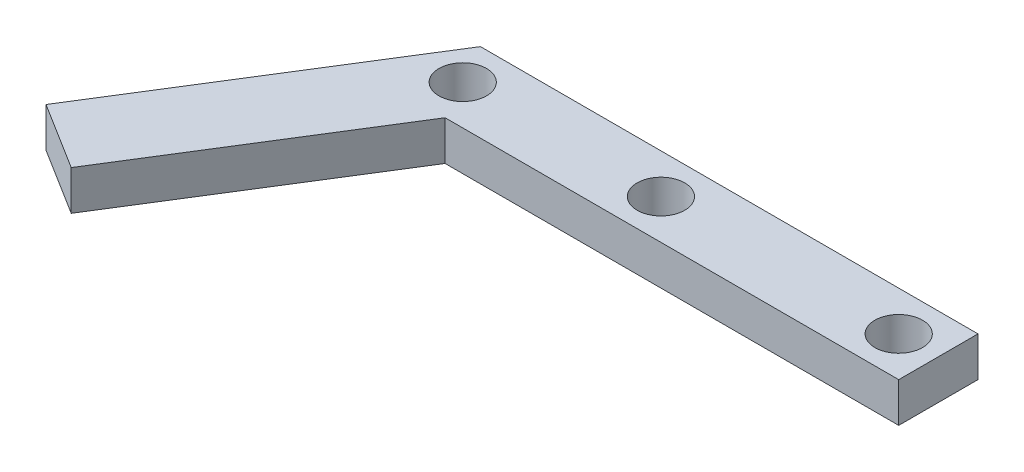
ISO-10303-21;
HEADER;
FILE_DESCRIPTION(('STEP AP214'),'2;1');
FILE_NAME('part.step','',(''),(''),'','','');
FILE_SCHEMA(('AUTOMOTIVE_DESIGN { 1 0 10303 214 1 1 1 1 }'));
ENDSEC;
DATA;
#1=APPLICATION_CONTEXT('core data for automotive mechanical design processes');
#2=APPLICATION_PROTOCOL_DEFINITION('international standard','automotive_design',2000,#1);
#3=PRODUCT_CONTEXT('',#1,'mechanical');
#4=PRODUCT('Part','Part','',(#3));
#5=PRODUCT_RELATED_PRODUCT_CATEGORY('part','',(#4));
#6=PRODUCT_DEFINITION_FORMATION('','',#4);
#7=PRODUCT_DEFINITION_CONTEXT('part definition',#1,'design');
#8=PRODUCT_DEFINITION('design','',#6,#7);
#9=PRODUCT_DEFINITION_SHAPE('','',#8);
#10=(LENGTH_UNIT() NAMED_UNIT(*) SI_UNIT(.MILLI.,.METRE.));
#11=(NAMED_UNIT(*) PLANE_ANGLE_UNIT() SI_UNIT($,.RADIAN.));
#12=(NAMED_UNIT(*) SI_UNIT($,.STERADIAN.) SOLID_ANGLE_UNIT());
#13=UNCERTAINTY_MEASURE_WITH_UNIT(LENGTH_MEASURE(1.E-05),#10,'distance_accuracy_value','');
#14=(GEOMETRIC_REPRESENTATION_CONTEXT(3) GLOBAL_UNCERTAINTY_ASSIGNED_CONTEXT((#13)) GLOBAL_UNIT_ASSIGNED_CONTEXT((#10,
#11,#12)) REPRESENTATION_CONTEXT('',''));
#15=CARTESIAN_POINT('',(0.,0.,0.));
#16=DIRECTION('',(0.,0.,1.));
#17=DIRECTION('',(1.,0.,0.));
#18=AXIS2_PLACEMENT_3D('',#15,#16,#17);
#19=CARTESIAN_POINT('',(0.,2.5,0.));
#20=DIRECTION('',(0.,1.,0.));
#21=DIRECTION('',(0.,0.,1.));
#22=AXIS2_PLACEMENT_3D('',#19,#20,#21);
#23=PLANE('',#22);
#24=CARTESIAN_POINT('',(71.9574164554625,2.5,-27.1375390770057));
#25=DIRECTION('',(0.,1.,0.));
#26=DIRECTION('',(0.,0.,1.));
#27=AXIS2_PLACEMENT_3D('',#24,#25,#26);
#28=CIRCLE('',#27,3.00000000000001);
#29=CARTESIAN_POINT('',(71.9574164554625,2.5,-24.1375390770057));
#30=VERTEX_POINT('',#29);
#31=EDGE_CURVE('E184',#30,#30,#28,.T.);
#32=ORIENTED_EDGE('',*,*,#31,.F.);
#33=EDGE_LOOP('',(#32));
#34=FACE_BOUND('',#33,.T.);
#35=DIRECTION('',(-0.529919264233202,0.,0.848048096156428));
#36=VECTOR('',#35,1.);
#37=CARTESIAN_POINT('',(-6.88983680194815,2.5,1.59064415961613));
#38=LINE('',#37,#36);
#39=CARTESIAN_POINT('',(14.1858711981986,2.5,-32.1375390770057));
#40=VERTEX_POINT('',#39);
#41=CARTESIAN_POINT('',(-6.88983680194815,2.5,1.59064415961613));
#42=VERTEX_POINT('',#41);
#43=EDGE_CURVE('E129',#40,#42,#38,.T.);
#44=ORIENTED_EDGE('',*,*,#43,.T.);
#45=DIRECTION('',(0.848048096156428,0.,0.529919264233202));
#46=VECTOR('',#45,1.);
#47=CARTESIAN_POINT('',(1.59064415961613,2.5,6.88983680194815));
#48=LINE('',#47,#46);
#49=CARTESIAN_POINT('',(1.59064415961613,2.5,6.88983680194815));
#50=VERTEX_POINT('',#49);
#51=EDGE_CURVE('E87',#42,#50,#48,.T.);
#52=ORIENTED_EDGE('',*,*,#51,.T.);
#53=DIRECTION('',(0.529919264233202,0.,-0.848048096156428));
#54=VECTOR('',#53,1.);
#55=CARTESIAN_POINT('',(1.59064415961613,2.5,6.88983680194815));
#56=LINE('',#55,#54);
#57=CARTESIAN_POINT('',(19.7289617127263,2.5,-22.1375390770057));
#58=VERTEX_POINT('',#57);
#59=EDGE_CURVE('E100',#50,#58,#56,.T.);
#60=ORIENTED_EDGE('',*,*,#59,.T.);
#61=DIRECTION('',(1.,0.,0.));
#62=VECTOR('',#61,1.);
#63=CARTESIAN_POINT('',(76.9574164554625,2.5,-22.1375390770057));
#64=LINE('',#63,#62);
#65=CARTESIAN_POINT('',(76.9574164554625,2.5,-22.1375390770057));
#66=VERTEX_POINT('',#65);
#67=EDGE_CURVE('E94',#58,#66,#64,.T.);
#68=ORIENTED_EDGE('',*,*,#67,.T.);
#69=DIRECTION('',(0.,0.,-1.));
#70=VECTOR('',#69,1.);
#71=CARTESIAN_POINT('',(76.9574164554625,2.5,-22.1375390770057));
#72=LINE('',#71,#70);
#73=CARTESIAN_POINT('',(76.9574164554625,2.5,-32.1375390770057));
#74=VERTEX_POINT('',#73);
#75=EDGE_CURVE('E98',#66,#74,#72,.T.);
#76=ORIENTED_EDGE('',*,*,#75,.T.);
#77=DIRECTION('',(-1.,0.,0.));
#78=VECTOR('',#77,1.);
#79=CARTESIAN_POINT('',(76.9574164554625,2.5,-32.1375390770057));
#80=LINE('',#79,#78);
#81=EDGE_CURVE('E50',#74,#40,#80,.T.);
#82=ORIENTED_EDGE('',*,*,#81,.T.);
#83=EDGE_LOOP('',(#44,#52,#60,#68,#76,#82));
#84=FACE_BOUND('',#83,.T.);
#85=CARTESIAN_POINT('',(16.9574164554625,2.5,-27.1375390770057));
#86=DIRECTION('',(0.,1.,0.));
#87=DIRECTION('',(0.,0.,1.));
#88=AXIS2_PLACEMENT_3D('',#85,#86,#87);
#89=CIRCLE('',#88,3.);
#90=CARTESIAN_POINT('',(16.9574164554625,2.5,-24.1375390770057));
#91=VERTEX_POINT('',#90);
#92=EDGE_CURVE('E122',#91,#91,#89,.T.);
#93=ORIENTED_EDGE('',*,*,#92,.F.);
#94=EDGE_LOOP('',(#93));
#95=FACE_BOUND('',#94,.T.);
#96=CARTESIAN_POINT('',(41.9574164554625,2.5,-27.1375390770057));
#97=DIRECTION('',(0.,1.,0.));
#98=DIRECTION('',(0.,0.,1.));
#99=AXIS2_PLACEMENT_3D('',#96,#97,#98);
#100=CIRCLE('',#99,3.);
#101=CARTESIAN_POINT('',(41.9574164554625,2.5,-24.1375390770057));
#102=VERTEX_POINT('',#101);
#103=EDGE_CURVE('E175',#102,#102,#100,.T.);
#104=ORIENTED_EDGE('',*,*,#103,.F.);
#105=EDGE_LOOP('',(#104));
#106=FACE_BOUND('',#105,.T.);
#107=ADVANCED_FACE('F33',(#34,#84,#95,#106),#23,.T.);
#108=CARTESIAN_POINT('',(0.,-2.5,0.));
#109=DIRECTION('',(0.,1.,0.));
#110=DIRECTION('',(0.,0.,1.));
#111=AXIS2_PLACEMENT_3D('',#108,#109,#110);
#112=PLANE('',#111);
#113=DIRECTION('',(-0.529919264233202,0.,0.848048096156428));
#114=VECTOR('',#113,1.);
#115=CARTESIAN_POINT('',(-6.88983680194815,-2.5,1.59064415961613));
#116=LINE('',#115,#114);
#117=CARTESIAN_POINT('',(14.1858711981986,-2.5,-32.1375390770057));
#118=VERTEX_POINT('',#117);
#119=CARTESIAN_POINT('',(-6.88983680194815,-2.5,1.59064415961613));
#120=VERTEX_POINT('',#119);
#121=EDGE_CURVE('E118',#118,#120,#116,.T.);
#122=ORIENTED_EDGE('',*,*,#121,.F.);
#123=DIRECTION('',(-1.,0.,0.));
#124=VECTOR('',#123,1.);
#125=CARTESIAN_POINT('',(76.9574164554625,-2.5,-32.1375390770057));
#126=LINE('',#125,#124);
#127=CARTESIAN_POINT('',(76.9574164554625,-2.5,-32.1375390770057));
#128=VERTEX_POINT('',#127);
#129=EDGE_CURVE('E79',#128,#118,#126,.T.);
#130=ORIENTED_EDGE('',*,*,#129,.F.);
#131=DIRECTION('',(0.,0.,-1.));
#132=VECTOR('',#131,1.);
#133=CARTESIAN_POINT('',(76.9574164554625,-2.5,-22.1375390770057));
#134=LINE('',#133,#132);
#135=CARTESIAN_POINT('',(76.9574164554625,-2.5,-22.1375390770057));
#136=VERTEX_POINT('',#135);
#137=EDGE_CURVE('E73',#136,#128,#134,.T.);
#138=ORIENTED_EDGE('',*,*,#137,.F.);
#139=DIRECTION('',(1.,0.,0.));
#140=VECTOR('',#139,1.);
#141=CARTESIAN_POINT('',(76.9574164554625,-2.5,-22.1375390770057));
#142=LINE('',#141,#140);
#143=CARTESIAN_POINT('',(19.7289617127263,-2.5,-22.1375390770057));
#144=VERTEX_POINT('',#143);
#145=EDGE_CURVE('E108',#144,#136,#142,.T.);
#146=ORIENTED_EDGE('',*,*,#145,.F.);
#147=DIRECTION('',(0.529919264233202,0.,-0.848048096156428));
#148=VECTOR('',#147,1.);
#149=CARTESIAN_POINT('',(1.59064415961613,-2.5,6.88983680194815));
#150=LINE('',#149,#148);
#151=CARTESIAN_POINT('',(1.59064415961613,-2.5,6.88983680194815));
#152=VERTEX_POINT('',#151);
#153=EDGE_CURVE('E124',#152,#144,#150,.T.);
#154=ORIENTED_EDGE('',*,*,#153,.F.);
#155=DIRECTION('',(0.848048096156428,0.,0.529919264233202));
#156=VECTOR('',#155,1.);
#157=CARTESIAN_POINT('',(1.59064415961613,-2.5,6.88983680194815));
#158=LINE('',#157,#156);
#159=EDGE_CURVE('E121',#120,#152,#158,.T.);
#160=ORIENTED_EDGE('',*,*,#159,.F.);
#161=EDGE_LOOP('',(#122,#130,#138,#146,#154,#160));
#162=FACE_BOUND('',#161,.T.);
#163=CARTESIAN_POINT('',(16.9574164554625,-2.5,-27.1375390770057));
#164=DIRECTION('',(0.,1.,0.));
#165=DIRECTION('',(0.,0.,1.));
#166=AXIS2_PLACEMENT_3D('',#163,#164,#165);
#167=CIRCLE('',#166,3.);
#168=CARTESIAN_POINT('',(16.9574164554625,-2.5,-24.1375390770057));
#169=VERTEX_POINT('',#168);
#170=EDGE_CURVE('E187',#169,#169,#167,.T.);
#171=ORIENTED_EDGE('',*,*,#170,.T.);
#172=EDGE_LOOP('',(#171));
#173=FACE_BOUND('',#172,.T.);
#174=CARTESIAN_POINT('',(71.9574164554625,-2.5,-27.1375390770057));
#175=DIRECTION('',(0.,1.,0.));
#176=DIRECTION('',(0.,0.,1.));
#177=AXIS2_PLACEMENT_3D('',#174,#175,#176);
#178=CIRCLE('',#177,3.00000000000001);
#179=CARTESIAN_POINT('',(71.9574164554625,-2.5,-24.1375390770057));
#180=VERTEX_POINT('',#179);
#181=EDGE_CURVE('E181',#180,#180,#178,.T.);
#182=ORIENTED_EDGE('',*,*,#181,.T.);
#183=EDGE_LOOP('',(#182));
#184=FACE_BOUND('',#183,.T.);
#185=CARTESIAN_POINT('',(41.9574164554625,-2.5,-27.1375390770057));
#186=DIRECTION('',(0.,1.,0.));
#187=DIRECTION('',(0.,0.,1.));
#188=AXIS2_PLACEMENT_3D('',#185,#186,#187);
#189=CIRCLE('',#188,3.);
#190=CARTESIAN_POINT('',(41.9574164554625,-2.5,-24.1375390770057));
#191=VERTEX_POINT('',#190);
#192=EDGE_CURVE('E178',#191,#191,#189,.T.);
#193=ORIENTED_EDGE('',*,*,#192,.T.);
#194=EDGE_LOOP('',(#193));
#195=FACE_BOUND('',#194,.T.);
#196=ADVANCED_FACE('F138',(#162,#173,#184,#195),#112,.F.);
#197=CARTESIAN_POINT('',(-6.88983680194815,2.5,1.59064415961613));
#198=DIRECTION('',(0.848048096156428,0.,0.529919264233202));
#199=DIRECTION('',(0.529919264233202,0.,-0.848048096156428));
#200=AXIS2_PLACEMENT_3D('',#197,#198,#199);
#201=PLANE('',#200);
#202=ORIENTED_EDGE('',*,*,#121,.T.);
#203=DIRECTION('',(0.,-1.,0.));
#204=VECTOR('',#203,1.);
#205=CARTESIAN_POINT('',(-6.88983680194815,2.5,1.59064415961613));
#206=LINE('',#205,#204);
#207=EDGE_CURVE('E11',#42,#120,#206,.T.);
#208=ORIENTED_EDGE('',*,*,#207,.F.);
#209=ORIENTED_EDGE('',*,*,#43,.F.);
#210=DIRECTION('',(0.,-1.,0.));
#211=VECTOR('',#210,1.);
#212=CARTESIAN_POINT('',(14.1858711981986,2.5,-32.1375390770057));
#213=LINE('',#212,#211);
#214=EDGE_CURVE('E114',#40,#118,#213,.T.);
#215=ORIENTED_EDGE('',*,*,#214,.T.);
#216=EDGE_LOOP('',(#202,#208,#209,#215));
#217=FACE_BOUND('',#216,.T.);
#218=ADVANCED_FACE('F35',(#217),#201,.F.);
#219=CARTESIAN_POINT('',(1.59064415961613,2.5,6.88983680194815));
#220=DIRECTION('',(0.529919264233202,0.,-0.848048096156428));
#221=DIRECTION('',(-0.848048096156428,0.,-0.529919264233202));
#222=AXIS2_PLACEMENT_3D('',#219,#220,#221);
#223=PLANE('',#222);
#224=ORIENTED_EDGE('',*,*,#159,.T.);
#225=DIRECTION('',(0.,-1.,0.));
#226=VECTOR('',#225,1.);
#227=CARTESIAN_POINT('',(1.59064415961613,2.5,6.88983680194815));
#228=LINE('',#227,#226);
#229=EDGE_CURVE('E42',#50,#152,#228,.T.);
#230=ORIENTED_EDGE('',*,*,#229,.F.);
#231=ORIENTED_EDGE('',*,*,#51,.F.);
#232=ORIENTED_EDGE('',*,*,#207,.T.);
#233=EDGE_LOOP('',(#224,#230,#231,#232));
#234=FACE_BOUND('',#233,.T.);
#235=ADVANCED_FACE('F237',(#234),#223,.F.);
#236=CARTESIAN_POINT('',(1.59064415961613,2.5,6.88983680194815));
#237=DIRECTION('',(-0.848048096156428,0.,-0.529919264233202));
#238=DIRECTION('',(-0.529919264233202,0.,0.848048096156428));
#239=AXIS2_PLACEMENT_3D('',#236,#237,#238);
#240=PLANE('',#239);
#241=ORIENTED_EDGE('',*,*,#153,.T.);
#242=DIRECTION('',(0.,-1.,0.));
#243=VECTOR('',#242,1.);
#244=CARTESIAN_POINT('',(19.7289617127263,2.5,-22.1375390770057));
#245=LINE('',#244,#243);
#246=EDGE_CURVE('E109',#58,#144,#245,.T.);
#247=ORIENTED_EDGE('',*,*,#246,.F.);
#248=ORIENTED_EDGE('',*,*,#59,.F.);
#249=ORIENTED_EDGE('',*,*,#229,.T.);
#250=EDGE_LOOP('',(#241,#247,#248,#249));
#251=FACE_BOUND('',#250,.T.);
#252=ADVANCED_FACE('F135',(#251),#240,.F.);
#253=CARTESIAN_POINT('',(76.9574164554625,2.5,-22.1375390770057));
#254=DIRECTION('',(0.,0.,-1.));
#255=DIRECTION('',(-1.,0.,0.));
#256=AXIS2_PLACEMENT_3D('',#253,#254,#255);
#257=PLANE('',#256);
#258=ORIENTED_EDGE('',*,*,#145,.T.);
#259=DIRECTION('',(0.,-1.,0.));
#260=VECTOR('',#259,1.);
#261=CARTESIAN_POINT('',(76.9574164554625,2.5,-22.1375390770057));
#262=LINE('',#261,#260);
#263=EDGE_CURVE('E105',#66,#136,#262,.T.);
#264=ORIENTED_EDGE('',*,*,#263,.F.);
#265=ORIENTED_EDGE('',*,*,#67,.F.);
#266=ORIENTED_EDGE('',*,*,#246,.T.);
#267=EDGE_LOOP('',(#258,#264,#265,#266));
#268=FACE_BOUND('',#267,.T.);
#269=ADVANCED_FACE('F106',(#268),#257,.F.);
#270=CARTESIAN_POINT('',(76.9574164554625,2.5,-22.1375390770057));
#271=DIRECTION('',(-1.,0.,0.));
#272=DIRECTION('',(0.,0.,1.));
#273=AXIS2_PLACEMENT_3D('',#270,#271,#272);
#274=PLANE('',#273);
#275=ORIENTED_EDGE('',*,*,#137,.T.);
#276=DIRECTION('',(0.,-1.,0.));
#277=VECTOR('',#276,1.);
#278=CARTESIAN_POINT('',(76.9574164554625,2.5,-32.1375390770057));
#279=LINE('',#278,#277);
#280=EDGE_CURVE('E110',#74,#128,#279,.T.);
#281=ORIENTED_EDGE('',*,*,#280,.F.);
#282=ORIENTED_EDGE('',*,*,#75,.F.);
#283=ORIENTED_EDGE('',*,*,#263,.T.);
#284=EDGE_LOOP('',(#275,#281,#282,#283));
#285=FACE_BOUND('',#284,.T.);
#286=ADVANCED_FACE('F112',(#285),#274,.F.);
#287=CARTESIAN_POINT('',(76.9574164554625,2.5,-32.1375390770057));
#288=DIRECTION('',(0.,0.,1.));
#289=DIRECTION('',(1.,0.,0.));
#290=AXIS2_PLACEMENT_3D('',#287,#288,#289);
#291=PLANE('',#290);
#292=ORIENTED_EDGE('',*,*,#129,.T.);
#293=ORIENTED_EDGE('',*,*,#214,.F.);
#294=ORIENTED_EDGE('',*,*,#81,.F.);
#295=ORIENTED_EDGE('',*,*,#280,.T.);
#296=EDGE_LOOP('',(#292,#293,#294,#295));
#297=FACE_BOUND('',#296,.T.);
#298=ADVANCED_FACE('F143',(#297),#291,.F.);
#299=CARTESIAN_POINT('',(16.9574164554625,2.5,-27.1375390770057));
#300=DIRECTION('',(0.,-1.,0.));
#301=DIRECTION('',(0.,0.,-1.));
#302=AXIS2_PLACEMENT_3D('',#299,#300,#301);
#303=CYLINDRICAL_SURFACE('',#302,3.);
#304=ORIENTED_EDGE('',*,*,#92,.T.);
#305=EDGE_LOOP('',(#304));
#306=FACE_BOUND('',#305,.T.);
#307=ORIENTED_EDGE('',*,*,#170,.F.);
#308=EDGE_LOOP('',(#307));
#309=FACE_BOUND('',#308,.T.);
#310=ADVANCED_FACE('F145',(#306,#309),#303,.F.);
#311=CARTESIAN_POINT('',(71.9574164554625,2.5,-27.1375390770057));
#312=DIRECTION('',(0.,-1.,0.));
#313=DIRECTION('',(0.,0.,-1.));
#314=AXIS2_PLACEMENT_3D('',#311,#312,#313);
#315=CYLINDRICAL_SURFACE('',#314,3.00000000000001);
#316=ORIENTED_EDGE('',*,*,#31,.T.);
#317=EDGE_LOOP('',(#316));
#318=FACE_BOUND('',#317,.T.);
#319=ORIENTED_EDGE('',*,*,#181,.F.);
#320=EDGE_LOOP('',(#319));
#321=FACE_BOUND('',#320,.T.);
#322=ADVANCED_FACE('F151',(#318,#321),#315,.F.);
#323=CARTESIAN_POINT('',(41.9574164554625,2.5,-27.1375390770057));
#324=DIRECTION('',(0.,-1.,0.));
#325=DIRECTION('',(0.,0.,-1.));
#326=AXIS2_PLACEMENT_3D('',#323,#324,#325);
#327=CYLINDRICAL_SURFACE('',#326,3.);
#328=ORIENTED_EDGE('',*,*,#103,.T.);
#329=EDGE_LOOP('',(#328));
#330=FACE_BOUND('',#329,.T.);
#331=ORIENTED_EDGE('',*,*,#192,.F.);
#332=EDGE_LOOP('',(#331));
#333=FACE_BOUND('',#332,.T.);
#334=ADVANCED_FACE('F166',(#330,#333),#327,.F.);
#335=CLOSED_SHELL('',(#107,#196,#218,#235,#252,#269,#286,#298,#310,#322,#334));
#336=MANIFOLD_SOLID_BREP('B2',#335);
#337=ADVANCED_BREP_SHAPE_REPRESENTATION('',(#18,#336),#14);
#338=SHAPE_DEFINITION_REPRESENTATION(#9,#337);
ENDSEC;
END-ISO-10303-21;
